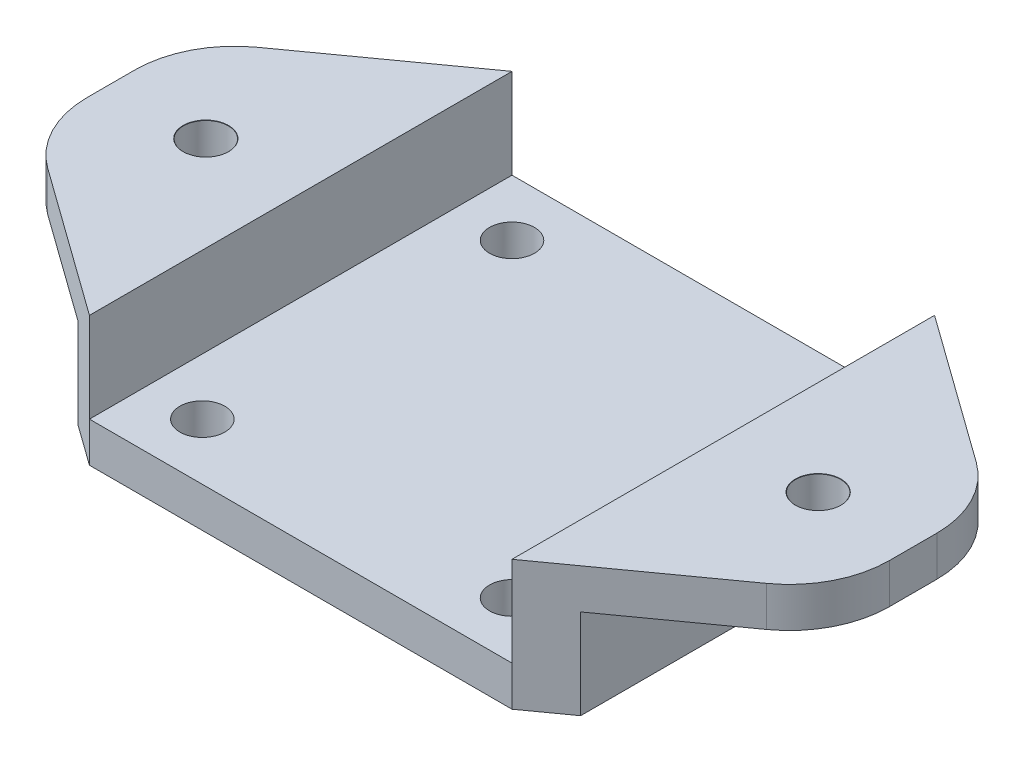
ISO-10303-21;
HEADER;
FILE_DESCRIPTION(('STEP AP214'),'2;1');
FILE_NAME('part.step','',(''),(''),'','','');
FILE_SCHEMA(('AUTOMOTIVE_DESIGN { 1 0 10303 214 1 1 1 1 }'));
ENDSEC;
DATA;
#1=APPLICATION_CONTEXT('core data for automotive mechanical design processes');
#2=APPLICATION_PROTOCOL_DEFINITION('international standard','automotive_design',2000,#1);
#3=PRODUCT_CONTEXT('',#1,'mechanical');
#4=PRODUCT('Part','Part','',(#3));
#5=PRODUCT_RELATED_PRODUCT_CATEGORY('part','',(#4));
#6=PRODUCT_DEFINITION_FORMATION('','',#4);
#7=PRODUCT_DEFINITION_CONTEXT('part definition',#1,'design');
#8=PRODUCT_DEFINITION('design','',#6,#7);
#9=PRODUCT_DEFINITION_SHAPE('','',#8);
#10=(LENGTH_UNIT() NAMED_UNIT(*) SI_UNIT(.MILLI.,.METRE.));
#11=(NAMED_UNIT(*) PLANE_ANGLE_UNIT() SI_UNIT($,.RADIAN.));
#12=(NAMED_UNIT(*) SI_UNIT($,.STERADIAN.) SOLID_ANGLE_UNIT());
#13=UNCERTAINTY_MEASURE_WITH_UNIT(LENGTH_MEASURE(1.E-05),#10,'distance_accuracy_value','');
#14=(GEOMETRIC_REPRESENTATION_CONTEXT(3) GLOBAL_UNCERTAINTY_ASSIGNED_CONTEXT((#13)) GLOBAL_UNIT_ASSIGNED_CONTEXT((#10,
#11,#12)) REPRESENTATION_CONTEXT('',''));
#15=CARTESIAN_POINT('',(0.,0.,0.));
#16=DIRECTION('',(0.,0.,1.));
#17=DIRECTION('',(1.,0.,0.));
#18=AXIS2_PLACEMENT_3D('',#15,#16,#17);
#19=CARTESIAN_POINT('',(25.15,4.,21.15));
#20=DIRECTION('',(-1.,0.,0.));
#21=DIRECTION('',(0.,0.,1.));
#22=AXIS2_PLACEMENT_3D('',#19,#20,#21);
#23=PLANE('',#22);
#24=DIRECTION('',(0.,0.,1.));
#25=VECTOR('',#24,1.);
#26=CARTESIAN_POINT('',(25.15,9.,-21.15));
#27=LINE('',#26,#25);
#28=CARTESIAN_POINT('',(25.15,9.,-18.2763157894737));
#29=VERTEX_POINT('',#28);
#30=CARTESIAN_POINT('',(25.15,9.,18.2763157894737));
#31=VERTEX_POINT('',#30);
#32=EDGE_CURVE('E174',#29,#31,#27,.T.);
#33=ORIENTED_EDGE('',*,*,#32,.T.);
#34=DIRECTION('',(0.,-1.,0.));
#35=VECTOR('',#34,1.);
#36=CARTESIAN_POINT('',(25.15,4.,18.2763157894737));
#37=LINE('',#36,#35);
#38=CARTESIAN_POINT('',(25.15,0.,18.2763157894737));
#39=VERTEX_POINT('',#38);
#40=EDGE_CURVE('E327',#31,#39,#37,.T.);
#41=ORIENTED_EDGE('',*,*,#40,.T.);
#42=DIRECTION('',(0.,0.,-1.));
#43=VECTOR('',#42,1.);
#44=CARTESIAN_POINT('',(25.15,0.,21.15));
#45=LINE('',#44,#43);
#46=CARTESIAN_POINT('',(25.15,0.,-18.2763157894737));
#47=VERTEX_POINT('',#46);
#48=EDGE_CURVE('E208',#39,#47,#45,.T.);
#49=ORIENTED_EDGE('',*,*,#48,.T.);
#50=DIRECTION('',(0.,1.,0.));
#51=VECTOR('',#50,1.);
#52=CARTESIAN_POINT('',(25.15,4.,-18.2763157894737));
#53=LINE('',#52,#51);
#54=EDGE_CURVE('E316',#47,#29,#53,.T.);
#55=ORIENTED_EDGE('',*,*,#54,.T.);
#56=EDGE_LOOP('',(#33,#41,#49,#55));
#57=FACE_BOUND('',#56,.T.);
#58=ADVANCED_FACE('F37',(#57),#23,.F.);
#59=CARTESIAN_POINT('',(-25.15,4.,-21.15));
#60=DIRECTION('',(0.,0.,1.));
#61=DIRECTION('',(1.,0.,0.));
#62=AXIS2_PLACEMENT_3D('',#59,#60,#61);
#63=PLANE('',#62);
#64=DIRECTION('',(-1.,0.,0.));
#65=VECTOR('',#64,1.);
#66=CARTESIAN_POINT('',(-25.15,4.,-21.15));
#67=LINE('',#66,#65);
#68=CARTESIAN_POINT('',(21.15,4.,-21.15));
#69=VERTEX_POINT('',#68);
#70=CARTESIAN_POINT('',(-21.15,4.,-21.15));
#71=VERTEX_POINT('',#70);
#72=EDGE_CURVE('E219',#69,#71,#67,.T.);
#73=ORIENTED_EDGE('',*,*,#72,.F.);
#74=DIRECTION('',(0.,1.,0.));
#75=VECTOR('',#74,1.);
#76=CARTESIAN_POINT('',(21.15,-29.3,-21.15));
#77=LINE('',#76,#75);
#78=CARTESIAN_POINT('',(21.15,0.,-21.15));
#79=VERTEX_POINT('',#78);
#80=EDGE_CURVE('E168',#79,#69,#77,.T.);
#81=ORIENTED_EDGE('',*,*,#80,.F.);
#82=DIRECTION('',(-1.,0.,0.));
#83=VECTOR('',#82,1.);
#84=CARTESIAN_POINT('',(-25.15,0.,-21.15));
#85=LINE('',#84,#83);
#86=CARTESIAN_POINT('',(-21.15,0.,-21.15));
#87=VERTEX_POINT('',#86);
#88=EDGE_CURVE('E229',#79,#87,#85,.T.);
#89=ORIENTED_EDGE('',*,*,#88,.T.);
#90=DIRECTION('',(0.,1.,0.));
#91=VECTOR('',#90,1.);
#92=CARTESIAN_POINT('',(-21.15,-29.3,-21.15));
#93=LINE('',#92,#91);
#94=EDGE_CURVE('E185',#87,#71,#93,.T.);
#95=ORIENTED_EDGE('',*,*,#94,.T.);
#96=EDGE_LOOP('',(#73,#81,#89,#95));
#97=FACE_BOUND('',#96,.T.);
#98=ADVANCED_FACE('F397',(#97),#63,.F.);
#99=CARTESIAN_POINT('',(-25.15,4.,21.15));
#100=DIRECTION('',(1.,0.,0.));
#101=DIRECTION('',(0.,0.,-1.));
#102=AXIS2_PLACEMENT_3D('',#99,#100,#101);
#103=PLANE('',#102);
#104=DIRECTION('',(0.,0.,1.));
#105=VECTOR('',#104,1.);
#106=CARTESIAN_POINT('',(-25.15,9.,-21.15));
#107=LINE('',#106,#105);
#108=CARTESIAN_POINT('',(-25.15,9.,-18.2763157894737));
#109=VERTEX_POINT('',#108);
#110=CARTESIAN_POINT('',(-25.15,9.,18.2763157894737));
#111=VERTEX_POINT('',#110);
#112=EDGE_CURVE('E205',#109,#111,#107,.T.);
#113=ORIENTED_EDGE('',*,*,#112,.F.);
#114=DIRECTION('',(0.,-1.,0.));
#115=VECTOR('',#114,1.);
#116=CARTESIAN_POINT('',(-25.15,4.,-18.2763157894737));
#117=LINE('',#116,#115);
#118=CARTESIAN_POINT('',(-25.15,0.,-18.2763157894737));
#119=VERTEX_POINT('',#118);
#120=EDGE_CURVE('E296',#109,#119,#117,.T.);
#121=ORIENTED_EDGE('',*,*,#120,.T.);
#122=DIRECTION('',(0.,0.,1.));
#123=VECTOR('',#122,1.);
#124=CARTESIAN_POINT('',(-25.15,0.,21.15));
#125=LINE('',#124,#123);
#126=CARTESIAN_POINT('',(-25.15,0.,18.2763157894737));
#127=VERTEX_POINT('',#126);
#128=EDGE_CURVE('E232',#119,#127,#125,.T.);
#129=ORIENTED_EDGE('',*,*,#128,.T.);
#130=DIRECTION('',(0.,1.,0.));
#131=VECTOR('',#130,1.);
#132=CARTESIAN_POINT('',(-25.15,4.,18.2763157894737));
#133=LINE('',#132,#131);
#134=EDGE_CURVE('E334',#127,#111,#133,.T.);
#135=ORIENTED_EDGE('',*,*,#134,.T.);
#136=EDGE_LOOP('',(#113,#121,#129,#135));
#137=FACE_BOUND('',#136,.T.);
#138=ADVANCED_FACE('F420',(#137),#103,.F.);
#139=CARTESIAN_POINT('',(-25.15,4.,21.15));
#140=DIRECTION('',(0.,0.,-1.));
#141=DIRECTION('',(-1.,0.,0.));
#142=AXIS2_PLACEMENT_3D('',#139,#140,#141);
#143=PLANE('',#142);
#144=DIRECTION('',(1.,0.,0.));
#145=VECTOR('',#144,1.);
#146=CARTESIAN_POINT('',(-25.15,0.,21.15));
#147=LINE('',#146,#145);
#148=CARTESIAN_POINT('',(-21.15,0.,21.15));
#149=VERTEX_POINT('',#148);
#150=CARTESIAN_POINT('',(21.15,0.,21.15));
#151=VERTEX_POINT('',#150);
#152=EDGE_CURVE('E223',#149,#151,#147,.T.);
#153=ORIENTED_EDGE('',*,*,#152,.T.);
#154=DIRECTION('',(0.,1.,0.));
#155=VECTOR('',#154,1.);
#156=CARTESIAN_POINT('',(21.15,-29.3,21.15));
#157=LINE('',#156,#155);
#158=CARTESIAN_POINT('',(21.15,4.,21.15));
#159=VERTEX_POINT('',#158);
#160=EDGE_CURVE('E388',#151,#159,#157,.T.);
#161=ORIENTED_EDGE('',*,*,#160,.T.);
#162=DIRECTION('',(1.,0.,0.));
#163=VECTOR('',#162,1.);
#164=CARTESIAN_POINT('',(-25.15,4.,21.15));
#165=LINE('',#164,#163);
#166=CARTESIAN_POINT('',(-21.15,4.,21.15));
#167=VERTEX_POINT('',#166);
#168=EDGE_CURVE('E222',#167,#159,#165,.T.);
#169=ORIENTED_EDGE('',*,*,#168,.F.);
#170=DIRECTION('',(0.,1.,0.));
#171=VECTOR('',#170,1.);
#172=CARTESIAN_POINT('',(-21.15,-29.3,21.15));
#173=LINE('',#172,#171);
#174=EDGE_CURVE('E314',#149,#167,#173,.T.);
#175=ORIENTED_EDGE('',*,*,#174,.F.);
#176=EDGE_LOOP('',(#153,#161,#169,#175));
#177=FACE_BOUND('',#176,.T.);
#178=ADVANCED_FACE('F584',(#177),#143,.F.);
#179=CARTESIAN_POINT('',(0.,4.,0.));
#180=DIRECTION('',(0.,-1.,0.));
#181=DIRECTION('',(0.,0.,-1.));
#182=AXIS2_PLACEMENT_3D('',#179,#180,#181);
#183=PLANE('',#182);
#184=CARTESIAN_POINT('',(-15.5,4.,15.5));
#185=DIRECTION('',(0.,1.,0.));
#186=DIRECTION('',(0.,0.,1.));
#187=AXIS2_PLACEMENT_3D('',#184,#185,#186);
#188=CIRCLE('',#187,2.25);
#189=CARTESIAN_POINT('',(-15.5,4.,17.75));
#190=VERTEX_POINT('',#189);
#191=EDGE_CURVE('E359',#190,#190,#188,.T.);
#192=ORIENTED_EDGE('',*,*,#191,.F.);
#193=EDGE_LOOP('',(#192));
#194=FACE_BOUND('',#193,.T.);
#195=CARTESIAN_POINT('',(15.5,4.,15.5));
#196=DIRECTION('',(0.,1.,0.));
#197=DIRECTION('',(0.,0.,1.));
#198=AXIS2_PLACEMENT_3D('',#195,#196,#197);
#199=CIRCLE('',#198,2.25);
#200=CARTESIAN_POINT('',(15.5,4.,17.75));
#201=VERTEX_POINT('',#200);
#202=EDGE_CURVE('E363',#201,#201,#199,.T.);
#203=ORIENTED_EDGE('',*,*,#202,.F.);
#204=EDGE_LOOP('',(#203));
#205=FACE_BOUND('',#204,.T.);
#206=CARTESIAN_POINT('',(15.5,4.,-15.5));
#207=DIRECTION('',(0.,1.,0.));
#208=DIRECTION('',(0.,0.,1.));
#209=AXIS2_PLACEMENT_3D('',#206,#207,#208);
#210=CIRCLE('',#209,2.25);
#211=CARTESIAN_POINT('',(15.5,4.,-13.25));
#212=VERTEX_POINT('',#211);
#213=EDGE_CURVE('E360',#212,#212,#210,.T.);
#214=ORIENTED_EDGE('',*,*,#213,.F.);
#215=EDGE_LOOP('',(#214));
#216=FACE_BOUND('',#215,.T.);
#217=CARTESIAN_POINT('',(-15.5,4.,-15.5));
#218=DIRECTION('',(0.,1.,0.));
#219=DIRECTION('',(0.,0.,1.));
#220=AXIS2_PLACEMENT_3D('',#217,#218,#219);
#221=CIRCLE('',#220,2.25);
#222=CARTESIAN_POINT('',(-15.5,4.,-13.25));
#223=VERTEX_POINT('',#222);
#224=EDGE_CURVE('E241',#223,#223,#221,.T.);
#225=ORIENTED_EDGE('',*,*,#224,.F.);
#226=EDGE_LOOP('',(#225));
#227=FACE_BOUND('',#226,.T.);
#228=ORIENTED_EDGE('',*,*,#168,.T.);
#229=DIRECTION('',(0.,0.,1.));
#230=VECTOR('',#229,1.);
#231=CARTESIAN_POINT('',(21.15,4.,-21.15));
#232=LINE('',#231,#230);
#233=EDGE_CURVE('E189',#69,#159,#232,.T.);
#234=ORIENTED_EDGE('',*,*,#233,.F.);
#235=ORIENTED_EDGE('',*,*,#72,.T.);
#236=DIRECTION('',(0.,0.,1.));
#237=VECTOR('',#236,1.);
#238=CARTESIAN_POINT('',(-21.15,4.,-21.15));
#239=LINE('',#238,#237);
#240=EDGE_CURVE('E203',#71,#167,#239,.T.);
#241=ORIENTED_EDGE('',*,*,#240,.T.);
#242=EDGE_LOOP('',(#228,#234,#235,#241));
#243=FACE_BOUND('',#242,.T.);
#244=ADVANCED_FACE('F402',(#194,#205,#216,#227,#243),#183,.F.);
#245=CARTESIAN_POINT('',(0.,0.,0.));
#246=DIRECTION('',(0.,-1.,0.));
#247=DIRECTION('',(0.,0.,-1.));
#248=AXIS2_PLACEMENT_3D('',#245,#246,#247);
#249=PLANE('',#248);
#250=DIRECTION('',(0.81214196127895,0.,-0.583459882708298));
#251=VECTOR('',#250,1.);
#252=CARTESIAN_POINT('',(17.221973105436,0.,23.9719772163578));
#253=LINE('',#252,#251);
#254=EDGE_CURVE('E330',#151,#39,#253,.T.);
#255=ORIENTED_EDGE('',*,*,#254,.F.);
#256=ORIENTED_EDGE('',*,*,#152,.F.);
#257=DIRECTION('',(0.81214196127895,0.,0.583459882708298));
#258=VECTOR('',#257,1.);
#259=CARTESIAN_POINT('',(-17.221973105436,0.,23.9719772163578));
#260=LINE('',#259,#258);
#261=EDGE_CURVE('E297',#127,#149,#260,.T.);
#262=ORIENTED_EDGE('',*,*,#261,.F.);
#263=ORIENTED_EDGE('',*,*,#128,.F.);
#264=DIRECTION('',(-0.81214196127895,0.,0.583459882708298));
#265=VECTOR('',#264,1.);
#266=CARTESIAN_POINT('',(-17.221973105436,0.,-23.9719772163578));
#267=LINE('',#266,#265);
#268=EDGE_CURVE('E339',#87,#119,#267,.T.);
#269=ORIENTED_EDGE('',*,*,#268,.F.);
#270=ORIENTED_EDGE('',*,*,#88,.F.);
#271=DIRECTION('',(-0.81214196127895,0.,-0.583459882708298));
#272=VECTOR('',#271,1.);
#273=CARTESIAN_POINT('',(17.221973105436,0.,-23.9719772163578));
#274=LINE('',#273,#272);
#275=EDGE_CURVE('E325',#47,#79,#274,.T.);
#276=ORIENTED_EDGE('',*,*,#275,.F.);
#277=ORIENTED_EDGE('',*,*,#48,.F.);
#278=EDGE_LOOP('',(#255,#256,#262,#263,#269,#270,#276,#277));
#279=FACE_BOUND('',#278,.T.);
#280=CARTESIAN_POINT('',(-15.5,0.,15.5));
#281=DIRECTION('',(0.,-1.,0.));
#282=DIRECTION('',(0.,0.,-1.));
#283=AXIS2_PLACEMENT_3D('',#280,#281,#282);
#284=CIRCLE('',#283,2.25);
#285=CARTESIAN_POINT('',(-15.5,0.,13.25));
#286=VERTEX_POINT('',#285);
#287=EDGE_CURVE('E194',#286,#286,#284,.T.);
#288=ORIENTED_EDGE('',*,*,#287,.F.);
#289=EDGE_LOOP('',(#288));
#290=FACE_BOUND('',#289,.T.);
#291=CARTESIAN_POINT('',(15.5,0.,15.5));
#292=DIRECTION('',(0.,-1.,0.));
#293=DIRECTION('',(0.,0.,-1.));
#294=AXIS2_PLACEMENT_3D('',#291,#292,#293);
#295=CIRCLE('',#294,2.25);
#296=CARTESIAN_POINT('',(15.5,0.,13.25));
#297=VERTEX_POINT('',#296);
#298=EDGE_CURVE('E244',#297,#297,#295,.T.);
#299=ORIENTED_EDGE('',*,*,#298,.F.);
#300=EDGE_LOOP('',(#299));
#301=FACE_BOUND('',#300,.T.);
#302=CARTESIAN_POINT('',(15.5,0.,-15.5));
#303=DIRECTION('',(0.,-1.,0.));
#304=DIRECTION('',(0.,0.,-1.));
#305=AXIS2_PLACEMENT_3D('',#302,#303,#304);
#306=CIRCLE('',#305,2.25);
#307=CARTESIAN_POINT('',(15.5,0.,-17.75));
#308=VERTEX_POINT('',#307);
#309=EDGE_CURVE('E240',#308,#308,#306,.T.);
#310=ORIENTED_EDGE('',*,*,#309,.F.);
#311=EDGE_LOOP('',(#310));
#312=FACE_BOUND('',#311,.T.);
#313=CARTESIAN_POINT('',(-15.5,0.,-15.5));
#314=DIRECTION('',(0.,-1.,0.));
#315=DIRECTION('',(0.,0.,-1.));
#316=AXIS2_PLACEMENT_3D('',#313,#314,#315);
#317=CIRCLE('',#316,2.25);
#318=CARTESIAN_POINT('',(-15.5,0.,-17.75));
#319=VERTEX_POINT('',#318);
#320=EDGE_CURVE('E237',#319,#319,#317,.T.);
#321=ORIENTED_EDGE('',*,*,#320,.F.);
#322=EDGE_LOOP('',(#321));
#323=FACE_BOUND('',#322,.T.);
#324=ADVANCED_FACE('F552',(#279,#290,#301,#312,#323),#249,.T.);
#325=CARTESIAN_POINT('',(-40.15,9.,-21.15));
#326=DIRECTION('',(0.,-1.,0.));
#327=DIRECTION('',(1.,0.,0.));
#328=AXIS2_PLACEMENT_3D('',#325,#326,#327);
#329=PLANE('',#328);
#330=DIRECTION('',(0.,0.,1.));
#331=VECTOR('',#330,1.);
#332=CARTESIAN_POINT('',(-40.15,9.,-21.15));
#333=LINE('',#332,#331);
#334=CARTESIAN_POINT('',(-40.15,9.,-2.37109228249036));
#335=VERTEX_POINT('',#334);
#336=CARTESIAN_POINT('',(-40.15,9.,2.37109228249036));
#337=VERTEX_POINT('',#336);
#338=EDGE_CURVE('E209',#335,#337,#333,.T.);
#339=ORIENTED_EDGE('',*,*,#338,.F.);
#340=CARTESIAN_POINT('',(-30.15,9.,-2.37109228249036));
#341=DIRECTION('',(0.,-1.,0.));
#342=DIRECTION('',(1.,0.,0.));
#343=AXIS2_PLACEMENT_3D('',#340,#341,#342);
#344=CIRCLE('',#343,10.);
#345=CARTESIAN_POINT('',(-35.984598827083,9.,-10.4925118952799));
#346=VERTEX_POINT('',#345);
#347=EDGE_CURVE('E45',#335,#346,#344,.T.);
#348=ORIENTED_EDGE('',*,*,#347,.T.);
#349=DIRECTION('',(-0.81214196127895,0.,0.583459882708298));
#350=VECTOR('',#349,1.);
#351=CARTESIAN_POINT('',(-33.6819167401304,9.,-12.1468071840642));
#352=LINE('',#351,#350);
#353=EDGE_CURVE('E287',#109,#346,#352,.T.);
#354=ORIENTED_EDGE('',*,*,#353,.F.);
#355=ORIENTED_EDGE('',*,*,#112,.T.);
#356=DIRECTION('',(0.81214196127895,0.,0.583459882708298));
#357=VECTOR('',#356,1.);
#358=CARTESIAN_POINT('',(-53.7258670619242,8.99999999999999,-2.25318870501394));
#359=LINE('',#358,#357);
#360=CARTESIAN_POINT('',(-35.984598827083,9.,10.4925118952799));
#361=VERTEX_POINT('',#360);
#362=EDGE_CURVE('E332',#361,#111,#359,.T.);
#363=ORIENTED_EDGE('',*,*,#362,.F.);
#364=CARTESIAN_POINT('',(-30.15,9.,2.37109228249036));
#365=DIRECTION('',(0.,-1.,0.));
#366=DIRECTION('',(1.,0.,0.));
#367=AXIS2_PLACEMENT_3D('',#364,#365,#366);
#368=CIRCLE('',#367,10.);
#369=EDGE_CURVE('E57',#361,#337,#368,.T.);
#370=ORIENTED_EDGE('',*,*,#369,.T.);
#371=EDGE_LOOP('',(#339,#348,#354,#355,#363,#370));
#372=FACE_BOUND('',#371,.T.);
#373=CARTESIAN_POINT('',(-30.65,9.,0.));
#374=DIRECTION('',(0.,1.,0.));
#375=DIRECTION('',(0.,0.,1.));
#376=AXIS2_PLACEMENT_3D('',#373,#374,#375);
#377=CIRCLE('',#376,2.25);
#378=CARTESIAN_POINT('',(-30.65,9.,2.25));
#379=VERTEX_POINT('',#378);
#380=EDGE_CURVE('E347',#379,#379,#377,.T.);
#381=ORIENTED_EDGE('',*,*,#380,.T.);
#382=EDGE_LOOP('',(#381));
#383=FACE_BOUND('',#382,.T.);
#384=ADVANCED_FACE('F285',(#372,#383),#329,.T.);
#385=CARTESIAN_POINT('',(-40.15,13.,-21.15));
#386=DIRECTION('',(-1.,0.,0.));
#387=DIRECTION('',(0.,0.,1.));
#388=AXIS2_PLACEMENT_3D('',#385,#386,#387);
#389=PLANE('',#388);
#390=DIRECTION('',(0.,0.,1.));
#391=VECTOR('',#390,1.);
#392=CARTESIAN_POINT('',(-40.15,13.,-21.15));
#393=LINE('',#392,#391);
#394=CARTESIAN_POINT('',(-40.15,13.,-2.37109228249036));
#395=VERTEX_POINT('',#394);
#396=CARTESIAN_POINT('',(-40.15,13.,2.37109228249036));
#397=VERTEX_POINT('',#396);
#398=EDGE_CURVE('E211',#395,#397,#393,.T.);
#399=ORIENTED_EDGE('',*,*,#398,.F.);
#400=DIRECTION('',(0.,1.,0.));
#401=VECTOR('',#400,1.);
#402=CARTESIAN_POINT('',(-40.15,9.,-2.37109228249036));
#403=LINE('',#402,#401);
#404=EDGE_CURVE('E280',#395,#335,#403,.F.);
#405=ORIENTED_EDGE('',*,*,#404,.T.);
#406=ORIENTED_EDGE('',*,*,#338,.T.);
#407=DIRECTION('',(0.,1.,0.));
#408=VECTOR('',#407,1.);
#409=CARTESIAN_POINT('',(-40.15,13.,2.37109228249036));
#410=LINE('',#409,#408);
#411=EDGE_CURVE('E277',#337,#397,#410,.T.);
#412=ORIENTED_EDGE('',*,*,#411,.T.);
#413=EDGE_LOOP('',(#399,#405,#406,#412));
#414=FACE_BOUND('',#413,.T.);
#415=ADVANCED_FACE('F307',(#414),#389,.T.);
#416=CARTESIAN_POINT('',(-21.15,13.,-21.15));
#417=DIRECTION('',(0.,1.,0.));
#418=DIRECTION('',(0.,0.,1.));
#419=AXIS2_PLACEMENT_3D('',#416,#417,#418);
#420=PLANE('',#419);
#421=DIRECTION('',(0.81214196127895,0.,-0.583459882708298));
#422=VECTOR('',#421,1.);
#423=CARTESIAN_POINT('',(-21.15,13.,-21.15));
#424=LINE('',#423,#422);
#425=CARTESIAN_POINT('',(-35.984598827083,13.,-10.4925118952799));
#426=VERTEX_POINT('',#425);
#427=CARTESIAN_POINT('',(-21.15,13.,-21.15));
#428=VERTEX_POINT('',#427);
#429=EDGE_CURVE('E305',#426,#428,#424,.T.);
#430=ORIENTED_EDGE('',*,*,#429,.F.);
#431=CARTESIAN_POINT('',(-30.15,13.,-2.37109228249036));
#432=DIRECTION('',(0.,1.,0.));
#433=DIRECTION('',(0.,0.,1.));
#434=AXIS2_PLACEMENT_3D('',#431,#432,#433);
#435=CIRCLE('',#434,10.);
#436=EDGE_CURVE('E275',#426,#395,#435,.T.);
#437=ORIENTED_EDGE('',*,*,#436,.T.);
#438=ORIENTED_EDGE('',*,*,#398,.T.);
#439=CARTESIAN_POINT('',(-30.15,13.,2.37109228249036));
#440=DIRECTION('',(0.,1.,0.));
#441=DIRECTION('',(0.,0.,1.));
#442=AXIS2_PLACEMENT_3D('',#439,#440,#441);
#443=CIRCLE('',#442,10.);
#444=CARTESIAN_POINT('',(-35.984598827083,13.,10.4925118952799));
#445=VERTEX_POINT('',#444);
#446=EDGE_CURVE('E273',#397,#445,#443,.T.);
#447=ORIENTED_EDGE('',*,*,#446,.T.);
#448=DIRECTION('',(-0.81214196127895,0.,-0.583459882708298));
#449=VECTOR('',#448,1.);
#450=CARTESIAN_POINT('',(-21.15,13.,21.15));
#451=LINE('',#450,#449);
#452=CARTESIAN_POINT('',(-21.15,13.,21.15));
#453=VERTEX_POINT('',#452);
#454=EDGE_CURVE('E311',#453,#445,#451,.T.);
#455=ORIENTED_EDGE('',*,*,#454,.F.);
#456=DIRECTION('',(0.,0.,1.));
#457=VECTOR('',#456,1.);
#458=CARTESIAN_POINT('',(-21.15,13.,-21.15));
#459=LINE('',#458,#457);
#460=EDGE_CURVE('E214',#428,#453,#459,.T.);
#461=ORIENTED_EDGE('',*,*,#460,.F.);
#462=EDGE_LOOP('',(#430,#437,#438,#447,#455,#461));
#463=FACE_BOUND('',#462,.T.);
#464=CARTESIAN_POINT('',(-30.65,13.,0.));
#465=DIRECTION('',(0.,1.,0.));
#466=DIRECTION('',(0.,0.,1.));
#467=AXIS2_PLACEMENT_3D('',#464,#465,#466);
#468=CIRCLE('',#467,2.275);
#469=CARTESIAN_POINT('',(-30.65,13.,2.275));
#470=VERTEX_POINT('',#469);
#471=EDGE_CURVE('E341',#470,#470,#468,.T.);
#472=ORIENTED_EDGE('',*,*,#471,.F.);
#473=EDGE_LOOP('',(#472));
#474=FACE_BOUND('',#473,.T.);
#475=ADVANCED_FACE('F302',(#463,#474),#420,.T.);
#476=CARTESIAN_POINT('',(-21.15,4.,-21.15));
#477=DIRECTION('',(1.,0.,0.));
#478=DIRECTION('',(0.,1.,0.));
#479=AXIS2_PLACEMENT_3D('',#476,#477,#478);
#480=PLANE('',#479);
#481=DIRECTION('',(0.,1.,0.));
#482=VECTOR('',#481,1.);
#483=CARTESIAN_POINT('',(-21.15,4.,21.15));
#484=LINE('',#483,#482);
#485=EDGE_CURVE('E198',#167,#453,#484,.T.);
#486=ORIENTED_EDGE('',*,*,#485,.F.);
#487=ORIENTED_EDGE('',*,*,#240,.F.);
#488=DIRECTION('',(0.,1.,0.));
#489=VECTOR('',#488,1.);
#490=CARTESIAN_POINT('',(-21.15,4.,-21.15));
#491=LINE('',#490,#489);
#492=EDGE_CURVE('E200',#71,#428,#491,.T.);
#493=ORIENTED_EDGE('',*,*,#492,.T.);
#494=ORIENTED_EDGE('',*,*,#460,.T.);
#495=EDGE_LOOP('',(#486,#487,#493,#494));
#496=FACE_BOUND('',#495,.T.);
#497=ADVANCED_FACE('F404',(#496),#480,.T.);
#498=CARTESIAN_POINT('',(21.15,13.,-21.15));
#499=DIRECTION('',(-1.,0.,0.));
#500=DIRECTION('',(0.,0.,1.));
#501=AXIS2_PLACEMENT_3D('',#498,#499,#500);
#502=PLANE('',#501);
#503=DIRECTION('',(0.,-1.,0.));
#504=VECTOR('',#503,1.);
#505=CARTESIAN_POINT('',(21.15,13.,21.15));
#506=LINE('',#505,#504);
#507=CARTESIAN_POINT('',(21.15,13.,21.15));
#508=VERTEX_POINT('',#507);
#509=EDGE_CURVE('E173',#508,#159,#506,.T.);
#510=ORIENTED_EDGE('',*,*,#509,.F.);
#511=DIRECTION('',(0.,0.,1.));
#512=VECTOR('',#511,1.);
#513=CARTESIAN_POINT('',(21.15,13.,-21.15));
#514=LINE('',#513,#512);
#515=CARTESIAN_POINT('',(21.15,13.,-21.15));
#516=VERTEX_POINT('',#515);
#517=EDGE_CURVE('E182',#516,#508,#514,.T.);
#518=ORIENTED_EDGE('',*,*,#517,.F.);
#519=DIRECTION('',(0.,-1.,0.));
#520=VECTOR('',#519,1.);
#521=CARTESIAN_POINT('',(21.15,13.,-21.15));
#522=LINE('',#521,#520);
#523=EDGE_CURVE('E162',#516,#69,#522,.T.);
#524=ORIENTED_EDGE('',*,*,#523,.T.);
#525=ORIENTED_EDGE('',*,*,#233,.T.);
#526=EDGE_LOOP('',(#510,#518,#524,#525));
#527=FACE_BOUND('',#526,.T.);
#528=ADVANCED_FACE('F187',(#527),#502,.T.);
#529=CARTESIAN_POINT('',(40.15,13.,-21.15));
#530=DIRECTION('',(0.,1.,0.));
#531=DIRECTION('',(0.,0.,1.));
#532=AXIS2_PLACEMENT_3D('',#529,#530,#531);
#533=PLANE('',#532);
#534=DIRECTION('',(0.,0.,1.));
#535=VECTOR('',#534,1.);
#536=CARTESIAN_POINT('',(40.15,13.,-21.15));
#537=LINE('',#536,#535);
#538=CARTESIAN_POINT('',(40.15,13.,-2.37109228249035));
#539=VERTEX_POINT('',#538);
#540=CARTESIAN_POINT('',(40.15,13.,2.37109228249036));
#541=VERTEX_POINT('',#540);
#542=EDGE_CURVE('E188',#539,#541,#537,.T.);
#543=ORIENTED_EDGE('',*,*,#542,.F.);
#544=CARTESIAN_POINT('',(30.15,13.,-2.37109228249035));
#545=DIRECTION('',(0.,1.,0.));
#546=DIRECTION('',(0.,0.,1.));
#547=AXIS2_PLACEMENT_3D('',#544,#545,#546);
#548=CIRCLE('',#547,10.);
#549=CARTESIAN_POINT('',(35.984598827083,13.,-10.4925118952799));
#550=VERTEX_POINT('',#549);
#551=EDGE_CURVE('E184',#539,#550,#548,.T.);
#552=ORIENTED_EDGE('',*,*,#551,.T.);
#553=DIRECTION('',(0.81214196127895,0.,0.583459882708298));
#554=VECTOR('',#553,1.);
#555=CARTESIAN_POINT('',(40.15,13.,-7.5));
#556=LINE('',#555,#554);
#557=EDGE_CURVE('E165',#516,#550,#556,.T.);
#558=ORIENTED_EDGE('',*,*,#557,.F.);
#559=ORIENTED_EDGE('',*,*,#517,.T.);
#560=DIRECTION('',(-0.81214196127895,0.,0.583459882708298));
#561=VECTOR('',#560,1.);
#562=CARTESIAN_POINT('',(40.15,13.,7.5));
#563=LINE('',#562,#561);
#564=CARTESIAN_POINT('',(35.984598827083,13.,10.4925118952799));
#565=VERTEX_POINT('',#564);
#566=EDGE_CURVE('E320',#565,#508,#563,.T.);
#567=ORIENTED_EDGE('',*,*,#566,.F.);
#568=CARTESIAN_POINT('',(30.15,13.,2.37109228249036));
#569=DIRECTION('',(0.,1.,0.));
#570=DIRECTION('',(0.,0.,1.));
#571=AXIS2_PLACEMENT_3D('',#568,#569,#570);
#572=CIRCLE('',#571,10.);
#573=EDGE_CURVE('E258',#565,#541,#572,.T.);
#574=ORIENTED_EDGE('',*,*,#573,.T.);
#575=EDGE_LOOP('',(#543,#552,#558,#559,#567,#574));
#576=FACE_BOUND('',#575,.T.);
#577=CARTESIAN_POINT('',(30.65,13.,0.));
#578=DIRECTION('',(0.,1.,0.));
#579=DIRECTION('',(0.,0.,1.));
#580=AXIS2_PLACEMENT_3D('',#577,#578,#579);
#581=CIRCLE('',#580,2.275);
#582=CARTESIAN_POINT('',(30.65,13.,2.27499999999999));
#583=VERTEX_POINT('',#582);
#584=EDGE_CURVE('E350',#583,#583,#581,.T.);
#585=ORIENTED_EDGE('',*,*,#584,.F.);
#586=EDGE_LOOP('',(#585));
#587=FACE_BOUND('',#586,.T.);
#588=ADVANCED_FACE('F179',(#576,#587),#533,.T.);
#589=CARTESIAN_POINT('',(40.15,9.,-21.15));
#590=DIRECTION('',(1.,0.,0.));
#591=DIRECTION('',(0.,1.,0.));
#592=AXIS2_PLACEMENT_3D('',#589,#590,#591);
#593=PLANE('',#592);
#594=DIRECTION('',(0.,0.,1.));
#595=VECTOR('',#594,1.);
#596=CARTESIAN_POINT('',(40.15,9.,-21.15));
#597=LINE('',#596,#595);
#598=CARTESIAN_POINT('',(40.15,9.,-2.37109228249035));
#599=VERTEX_POINT('',#598);
#600=CARTESIAN_POINT('',(40.15,9.,2.37109228249036));
#601=VERTEX_POINT('',#600);
#602=EDGE_CURVE('E192',#599,#601,#597,.T.);
#603=ORIENTED_EDGE('',*,*,#602,.F.);
#604=DIRECTION('',(0.,1.,0.));
#605=VECTOR('',#604,1.);
#606=CARTESIAN_POINT('',(40.15,13.,-2.37109228249035));
#607=LINE('',#606,#605);
#608=EDGE_CURVE('E255',#599,#539,#607,.T.);
#609=ORIENTED_EDGE('',*,*,#608,.T.);
#610=ORIENTED_EDGE('',*,*,#542,.T.);
#611=DIRECTION('',(0.,1.,0.));
#612=VECTOR('',#611,1.);
#613=CARTESIAN_POINT('',(40.15,9.00000000000001,2.37109228249036));
#614=LINE('',#613,#612);
#615=EDGE_CURVE('E253',#541,#601,#614,.F.);
#616=ORIENTED_EDGE('',*,*,#615,.T.);
#617=EDGE_LOOP('',(#603,#609,#610,#616));
#618=FACE_BOUND('',#617,.T.);
#619=ADVANCED_FACE('F504',(#618),#593,.T.);
#620=CARTESIAN_POINT('',(25.15,9.,-21.15));
#621=DIRECTION('',(0.,-1.,0.));
#622=DIRECTION('',(0.,0.,-1.));
#623=AXIS2_PLACEMENT_3D('',#620,#621,#622);
#624=PLANE('',#623);
#625=DIRECTION('',(-0.81214196127895,0.,-0.583459882708298));
#626=VECTOR('',#625,1.);
#627=CARTESIAN_POINT('',(23.7882982610801,9.,-19.2545909861188));
#628=LINE('',#627,#626);
#629=CARTESIAN_POINT('',(35.984598827083,9.,-10.4925118952798));
#630=VERTEX_POINT('',#629);
#631=EDGE_CURVE('E226',#630,#29,#628,.T.);
#632=ORIENTED_EDGE('',*,*,#631,.F.);
#633=CARTESIAN_POINT('',(30.15,9.,-2.37109228249035));
#634=DIRECTION('',(0.,-1.,0.));
#635=DIRECTION('',(0.,0.,-1.));
#636=AXIS2_PLACEMENT_3D('',#633,#634,#635);
#637=CIRCLE('',#636,10.);
#638=EDGE_CURVE('E265',#630,#599,#637,.T.);
#639=ORIENTED_EDGE('',*,*,#638,.T.);
#640=ORIENTED_EDGE('',*,*,#602,.T.);
#641=CARTESIAN_POINT('',(30.15,9.,2.37109228249036));
#642=DIRECTION('',(0.,-1.,0.));
#643=DIRECTION('',(0.,0.,-1.));
#644=AXIS2_PLACEMENT_3D('',#641,#642,#643);
#645=CIRCLE('',#644,10.);
#646=CARTESIAN_POINT('',(35.984598827083,9.,10.4925118952799));
#647=VERTEX_POINT('',#646);
#648=EDGE_CURVE('E263',#601,#647,#645,.T.);
#649=ORIENTED_EDGE('',*,*,#648,.T.);
#650=DIRECTION('',(0.81214196127895,0.,-0.583459882708298));
#651=VECTOR('',#650,1.);
#652=CARTESIAN_POINT('',(43.8322485828739,9.,4.8545950970406));
#653=LINE('',#652,#651);
#654=EDGE_CURVE('E250',#31,#647,#653,.T.);
#655=ORIENTED_EDGE('',*,*,#654,.F.);
#656=ORIENTED_EDGE('',*,*,#32,.F.);
#657=EDGE_LOOP('',(#632,#639,#640,#649,#655,#656));
#658=FACE_BOUND('',#657,.T.);
#659=CARTESIAN_POINT('',(30.65,9.,0.));
#660=DIRECTION('',(0.,1.,0.));
#661=DIRECTION('',(0.,0.,1.));
#662=AXIS2_PLACEMENT_3D('',#659,#660,#661);
#663=CIRCLE('',#662,2.25);
#664=CARTESIAN_POINT('',(30.65,9.,2.24999999999999));
#665=VERTEX_POINT('',#664);
#666=EDGE_CURVE('E356',#665,#665,#663,.T.);
#667=ORIENTED_EDGE('',*,*,#666,.T.);
#668=EDGE_LOOP('',(#667));
#669=FACE_BOUND('',#668,.T.);
#670=ADVANCED_FACE('F376',(#658,#669),#624,.T.);
#671=CARTESIAN_POINT('',(-15.5,-38.3,-15.5));
#672=DIRECTION('',(0.,1.,0.));
#673=DIRECTION('',(0.,0.,1.));
#674=AXIS2_PLACEMENT_3D('',#671,#672,#673);
#675=CYLINDRICAL_SURFACE('',#674,2.25);
#676=ORIENTED_EDGE('',*,*,#320,.T.);
#677=EDGE_LOOP('',(#676));
#678=FACE_BOUND('',#677,.T.);
#679=ORIENTED_EDGE('',*,*,#224,.T.);
#680=EDGE_LOOP('',(#679));
#681=FACE_BOUND('',#680,.T.);
#682=ADVANCED_FACE('F503',(#678,#681),#675,.F.);
#683=CARTESIAN_POINT('',(15.5,-38.3,-15.5));
#684=DIRECTION('',(0.,1.,0.));
#685=DIRECTION('',(0.,0.,1.));
#686=AXIS2_PLACEMENT_3D('',#683,#684,#685);
#687=CYLINDRICAL_SURFACE('',#686,2.25);
#688=ORIENTED_EDGE('',*,*,#309,.T.);
#689=EDGE_LOOP('',(#688));
#690=FACE_BOUND('',#689,.T.);
#691=ORIENTED_EDGE('',*,*,#213,.T.);
#692=EDGE_LOOP('',(#691));
#693=FACE_BOUND('',#692,.T.);
#694=ADVANCED_FACE('F676',(#690,#693),#687,.F.);
#695=CARTESIAN_POINT('',(15.5,-38.3,15.5));
#696=DIRECTION('',(0.,1.,0.));
#697=DIRECTION('',(0.,0.,1.));
#698=AXIS2_PLACEMENT_3D('',#695,#696,#697);
#699=CYLINDRICAL_SURFACE('',#698,2.25);
#700=ORIENTED_EDGE('',*,*,#298,.T.);
#701=EDGE_LOOP('',(#700));
#702=FACE_BOUND('',#701,.T.);
#703=ORIENTED_EDGE('',*,*,#202,.T.);
#704=EDGE_LOOP('',(#703));
#705=FACE_BOUND('',#704,.T.);
#706=ADVANCED_FACE('F665',(#702,#705),#699,.F.);
#707=CARTESIAN_POINT('',(-15.5,-38.3,15.5));
#708=DIRECTION('',(0.,1.,0.));
#709=DIRECTION('',(0.,0.,1.));
#710=AXIS2_PLACEMENT_3D('',#707,#708,#709);
#711=CYLINDRICAL_SURFACE('',#710,2.25);
#712=ORIENTED_EDGE('',*,*,#287,.T.);
#713=EDGE_LOOP('',(#712));
#714=FACE_BOUND('',#713,.T.);
#715=ORIENTED_EDGE('',*,*,#191,.T.);
#716=EDGE_LOOP('',(#715));
#717=FACE_BOUND('',#716,.T.);
#718=ADVANCED_FACE('F654',(#714,#717),#711,.F.);
#719=CARTESIAN_POINT('',(30.65,13.,0.));
#720=DIRECTION('',(0.,1.,0.));
#721=DIRECTION('',(0.,0.,1.));
#722=AXIS2_PLACEMENT_3D('',#719,#720,#721);
#723=CYLINDRICAL_SURFACE('',#722,2.25);
#724=ORIENTED_EDGE('',*,*,#666,.F.);
#725=EDGE_LOOP('',(#724));
#726=FACE_BOUND('',#725,.T.);
#727=CARTESIAN_POINT('',(30.65,12.975,0.));
#728=DIRECTION('',(0.,1.,0.));
#729=DIRECTION('',(0.,0.,1.));
#730=AXIS2_PLACEMENT_3D('',#727,#728,#729);
#731=CIRCLE('',#730,2.25);
#732=CARTESIAN_POINT('',(30.65,12.975,2.24999999999999));
#733=VERTEX_POINT('',#732);
#734=EDGE_CURVE('E353',#733,#733,#731,.T.);
#735=ORIENTED_EDGE('',*,*,#734,.T.);
#736=EDGE_LOOP('',(#735));
#737=FACE_BOUND('',#736,.T.);
#738=ADVANCED_FACE('F643',(#726,#737),#723,.F.);
#739=CARTESIAN_POINT('',(30.65,13.,0.));
#740=DIRECTION('',(0.,1.,0.));
#741=DIRECTION('',(0.,0.,1.));
#742=AXIS2_PLACEMENT_3D('',#739,#740,#741);
#743=CONICAL_SURFACE('',#742,2.275,0.785398163397448);
#744=ORIENTED_EDGE('',*,*,#734,.F.);
#745=EDGE_LOOP('',(#744));
#746=FACE_BOUND('',#745,.T.);
#747=ORIENTED_EDGE('',*,*,#584,.T.);
#748=EDGE_LOOP('',(#747));
#749=FACE_BOUND('',#748,.T.);
#750=ADVANCED_FACE('F632',(#746,#749),#743,.F.);
#751=CARTESIAN_POINT('',(-30.65,13.,0.));
#752=DIRECTION('',(0.,1.,0.));
#753=DIRECTION('',(0.,0.,1.));
#754=AXIS2_PLACEMENT_3D('',#751,#752,#753);
#755=CYLINDRICAL_SURFACE('',#754,2.25);
#756=ORIENTED_EDGE('',*,*,#380,.F.);
#757=EDGE_LOOP('',(#756));
#758=FACE_BOUND('',#757,.T.);
#759=CARTESIAN_POINT('',(-30.65,12.975,0.));
#760=DIRECTION('',(0.,1.,0.));
#761=DIRECTION('',(0.,0.,1.));
#762=AXIS2_PLACEMENT_3D('',#759,#760,#761);
#763=CIRCLE('',#762,2.25);
#764=CARTESIAN_POINT('',(-30.65,12.975,2.25));
#765=VERTEX_POINT('',#764);
#766=EDGE_CURVE('E344',#765,#765,#763,.T.);
#767=ORIENTED_EDGE('',*,*,#766,.T.);
#768=EDGE_LOOP('',(#767));
#769=FACE_BOUND('',#768,.T.);
#770=ADVANCED_FACE('F621',(#758,#769),#755,.F.);
#771=CARTESIAN_POINT('',(-30.65,13.,0.));
#772=DIRECTION('',(0.,1.,0.));
#773=DIRECTION('',(0.,0.,1.));
#774=AXIS2_PLACEMENT_3D('',#771,#772,#773);
#775=CONICAL_SURFACE('',#774,2.275,0.785398163397448);
#776=ORIENTED_EDGE('',*,*,#766,.F.);
#777=EDGE_LOOP('',(#776));
#778=FACE_BOUND('',#777,.T.);
#779=ORIENTED_EDGE('',*,*,#471,.T.);
#780=EDGE_LOOP('',(#779));
#781=FACE_BOUND('',#780,.T.);
#782=ADVANCED_FACE('F491',(#778,#781),#775,.F.);
#783=CARTESIAN_POINT('',(40.15,-29.3,-7.5));
#784=DIRECTION('',(-0.583459882708298,0.,0.81214196127895));
#785=DIRECTION('',(0.81214196127895,0.,0.583459882708298));
#786=AXIS2_PLACEMENT_3D('',#783,#784,#785);
#787=PLANE('',#786);
#788=ORIENTED_EDGE('',*,*,#557,.T.);
#789=DIRECTION('',(0.,1.,0.));
#790=VECTOR('',#789,1.);
#791=CARTESIAN_POINT('',(35.984598827083,8.99999999999999,-10.4925118952799));
#792=LINE('',#791,#790);
#793=EDGE_CURVE('E261',#550,#630,#792,.F.);
#794=ORIENTED_EDGE('',*,*,#793,.T.);
#795=ORIENTED_EDGE('',*,*,#631,.T.);
#796=ORIENTED_EDGE('',*,*,#54,.F.);
#797=ORIENTED_EDGE('',*,*,#275,.T.);
#798=ORIENTED_EDGE('',*,*,#80,.T.);
#799=ORIENTED_EDGE('',*,*,#523,.F.);
#800=EDGE_LOOP('',(#788,#794,#795,#796,#797,#798,#799));
#801=FACE_BOUND('',#800,.T.);
#802=ADVANCED_FACE('F164',(#801),#787,.F.);
#803=CARTESIAN_POINT('',(40.15,-29.3,7.5));
#804=DIRECTION('',(-0.583459882708298,0.,-0.81214196127895));
#805=DIRECTION('',(-0.81214196127895,0.,0.583459882708298));
#806=AXIS2_PLACEMENT_3D('',#803,#804,#805);
#807=PLANE('',#806);
#808=ORIENTED_EDGE('',*,*,#654,.T.);
#809=DIRECTION('',(0.,1.,0.));
#810=VECTOR('',#809,1.);
#811=CARTESIAN_POINT('',(35.984598827083,13.,10.4925118952799));
#812=LINE('',#811,#810);
#813=EDGE_CURVE('E267',#647,#565,#812,.T.);
#814=ORIENTED_EDGE('',*,*,#813,.T.);
#815=ORIENTED_EDGE('',*,*,#566,.T.);
#816=ORIENTED_EDGE('',*,*,#509,.T.);
#817=ORIENTED_EDGE('',*,*,#160,.F.);
#818=ORIENTED_EDGE('',*,*,#254,.T.);
#819=ORIENTED_EDGE('',*,*,#40,.F.);
#820=EDGE_LOOP('',(#808,#814,#815,#816,#817,#818,#819));
#821=FACE_BOUND('',#820,.T.);
#822=ADVANCED_FACE('F387',(#821),#807,.F.);
#823=CARTESIAN_POINT('',(-21.15,-29.3,21.15));
#824=DIRECTION('',(0.583459882708298,0.,-0.81214196127895));
#825=DIRECTION('',(-0.81214196127895,0.,-0.583459882708298));
#826=AXIS2_PLACEMENT_3D('',#823,#824,#825);
#827=PLANE('',#826);
#828=ORIENTED_EDGE('',*,*,#454,.T.);
#829=DIRECTION('',(0.,1.,0.));
#830=VECTOR('',#829,1.);
#831=CARTESIAN_POINT('',(-35.984598827083,9.,10.4925118952799));
#832=LINE('',#831,#830);
#833=EDGE_CURVE('E11',#445,#361,#832,.F.);
#834=ORIENTED_EDGE('',*,*,#833,.T.);
#835=ORIENTED_EDGE('',*,*,#362,.T.);
#836=ORIENTED_EDGE('',*,*,#134,.F.);
#837=ORIENTED_EDGE('',*,*,#261,.T.);
#838=ORIENTED_EDGE('',*,*,#174,.T.);
#839=ORIENTED_EDGE('',*,*,#485,.T.);
#840=EDGE_LOOP('',(#828,#834,#835,#836,#837,#838,#839));
#841=FACE_BOUND('',#840,.T.);
#842=ADVANCED_FACE('F312',(#841),#827,.F.);
#843=CARTESIAN_POINT('',(-21.15,-29.3,-21.15));
#844=DIRECTION('',(0.583459882708298,0.,0.81214196127895));
#845=DIRECTION('',(0.81214196127895,0.,-0.583459882708298));
#846=AXIS2_PLACEMENT_3D('',#843,#844,#845);
#847=PLANE('',#846);
#848=ORIENTED_EDGE('',*,*,#353,.T.);
#849=DIRECTION('',(0.,1.,0.));
#850=VECTOR('',#849,1.);
#851=CARTESIAN_POINT('',(-35.984598827083,13.,-10.4925118952799));
#852=LINE('',#851,#850);
#853=EDGE_CURVE('E270',#346,#426,#852,.T.);
#854=ORIENTED_EDGE('',*,*,#853,.T.);
#855=ORIENTED_EDGE('',*,*,#429,.T.);
#856=ORIENTED_EDGE('',*,*,#492,.F.);
#857=ORIENTED_EDGE('',*,*,#94,.F.);
#858=ORIENTED_EDGE('',*,*,#268,.T.);
#859=ORIENTED_EDGE('',*,*,#120,.F.);
#860=EDGE_LOOP('',(#848,#854,#855,#856,#857,#858,#859));
#861=FACE_BOUND('',#860,.T.);
#862=ADVANCED_FACE('F293',(#861),#847,.F.);
#863=CARTESIAN_POINT('',(30.15,9.,-2.37109228249035));
#864=DIRECTION('',(0.,-1.,0.));
#865=DIRECTION('',(1.,0.,0.));
#866=AXIS2_PLACEMENT_3D('',#863,#864,#865);
#867=CYLINDRICAL_SURFACE('',#866,10.);
#868=ORIENTED_EDGE('',*,*,#638,.F.);
#869=ORIENTED_EDGE('',*,*,#793,.F.);
#870=ORIENTED_EDGE('',*,*,#551,.F.);
#871=ORIENTED_EDGE('',*,*,#608,.F.);
#872=EDGE_LOOP('',(#868,#869,#870,#871));
#873=FACE_BOUND('',#872,.T.);
#874=ADVANCED_FACE('F424',(#873),#867,.T.);
#875=CARTESIAN_POINT('',(30.1500000000001,-29.3,2.37109228249031));
#876=DIRECTION('',(0.,-1.,0.));
#877=DIRECTION('',(1.,0.,0.));
#878=AXIS2_PLACEMENT_3D('',#875,#876,#877);
#879=CYLINDRICAL_SURFACE('',#878,10.);
#880=ORIENTED_EDGE('',*,*,#648,.F.);
#881=ORIENTED_EDGE('',*,*,#615,.F.);
#882=ORIENTED_EDGE('',*,*,#573,.F.);
#883=ORIENTED_EDGE('',*,*,#813,.F.);
#884=EDGE_LOOP('',(#880,#881,#882,#883));
#885=FACE_BOUND('',#884,.T.);
#886=ADVANCED_FACE('F385',(#885),#879,.T.);
#887=CARTESIAN_POINT('',(-30.15,-29.3,-2.37109228249036));
#888=DIRECTION('',(0.,-1.,0.));
#889=DIRECTION('',(0.,0.,-1.));
#890=AXIS2_PLACEMENT_3D('',#887,#888,#889);
#891=CYLINDRICAL_SURFACE('',#890,10.);
#892=ORIENTED_EDGE('',*,*,#347,.F.);
#893=ORIENTED_EDGE('',*,*,#404,.F.);
#894=ORIENTED_EDGE('',*,*,#436,.F.);
#895=ORIENTED_EDGE('',*,*,#853,.F.);
#896=EDGE_LOOP('',(#892,#893,#894,#895));
#897=FACE_BOUND('',#896,.T.);
#898=ADVANCED_FACE('F299',(#897),#891,.T.);
#899=CARTESIAN_POINT('',(-30.15,13.,2.37109228249036));
#900=DIRECTION('',(0.,-1.,0.));
#901=DIRECTION('',(0.,0.,-1.));
#902=AXIS2_PLACEMENT_3D('',#899,#900,#901);
#903=CYLINDRICAL_SURFACE('',#902,10.);
#904=ORIENTED_EDGE('',*,*,#369,.F.);
#905=ORIENTED_EDGE('',*,*,#833,.F.);
#906=ORIENTED_EDGE('',*,*,#446,.F.);
#907=ORIENTED_EDGE('',*,*,#411,.F.);
#908=EDGE_LOOP('',(#904,#905,#906,#907));
#909=FACE_BOUND('',#908,.T.);
#910=ADVANCED_FACE('F39',(#909),#903,.T.);
#911=CLOSED_SHELL('',(#58,#98,#138,#178,#244,#324,#384,#415,#475,#497,#528,#588,#619,#670,#682,
#694,#706,#718,#738,#750,#770,#782,#802,#822,#842,#862,#874,#886,#898,#910));
#912=MANIFOLD_SOLID_BREP('B2',#911);
#913=ADVANCED_BREP_SHAPE_REPRESENTATION('',(#18,#912),#14);
#914=SHAPE_DEFINITION_REPRESENTATION(#9,#913);
ENDSEC;
END-ISO-10303-21;
